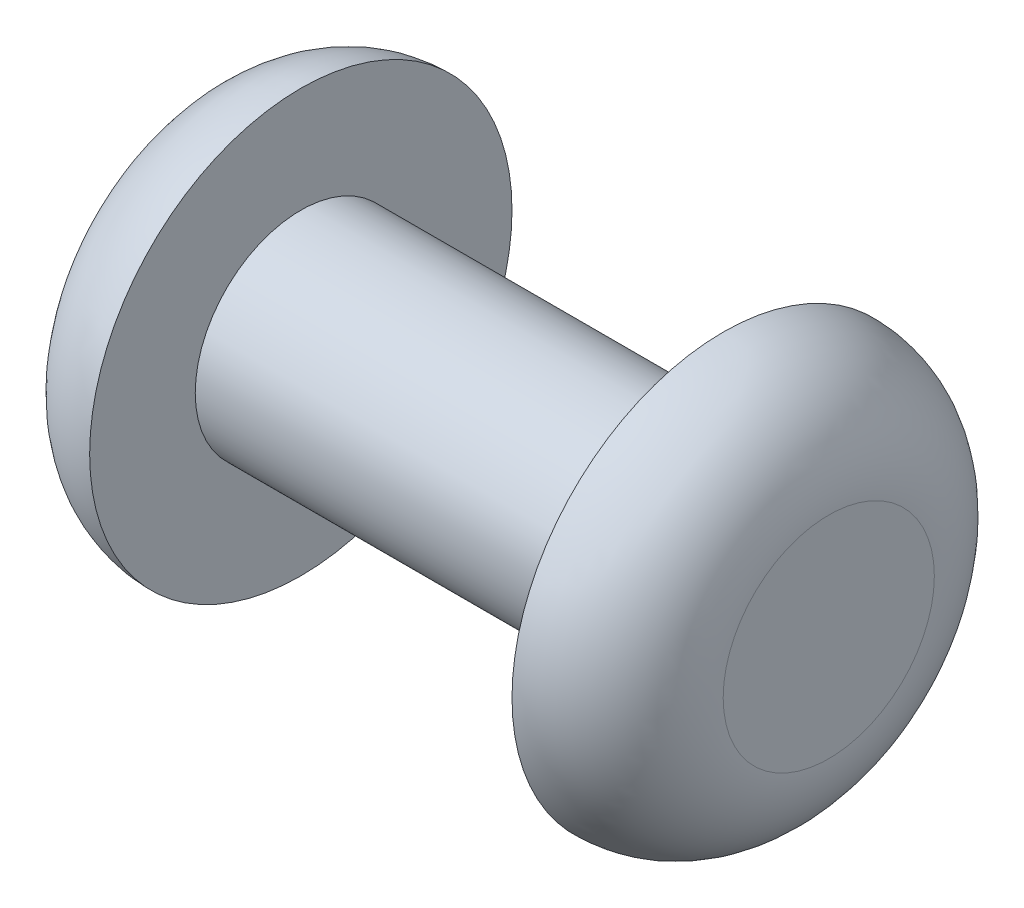
ISO-10303-21;
HEADER;
FILE_DESCRIPTION(('STEP AP214'),'2;1');
FILE_NAME('part.step','',(''),(''),'','','');
FILE_SCHEMA(('AUTOMOTIVE_DESIGN { 1 0 10303 214 1 1 1 1 }'));
ENDSEC;
DATA;
#1=APPLICATION_CONTEXT('core data for automotive mechanical design processes');
#2=APPLICATION_PROTOCOL_DEFINITION('international standard','automotive_design',2000,#1);
#3=PRODUCT_CONTEXT('',#1,'mechanical');
#4=PRODUCT('Part','Part','',(#3));
#5=PRODUCT_RELATED_PRODUCT_CATEGORY('part','',(#4));
#6=PRODUCT_DEFINITION_FORMATION('','',#4);
#7=PRODUCT_DEFINITION_CONTEXT('part definition',#1,'design');
#8=PRODUCT_DEFINITION('design','',#6,#7);
#9=PRODUCT_DEFINITION_SHAPE('','',#8);
#10=(LENGTH_UNIT() NAMED_UNIT(*) SI_UNIT(.MILLI.,.METRE.));
#11=(NAMED_UNIT(*) PLANE_ANGLE_UNIT() SI_UNIT($,.RADIAN.));
#12=(NAMED_UNIT(*) SI_UNIT($,.STERADIAN.) SOLID_ANGLE_UNIT());
#13=UNCERTAINTY_MEASURE_WITH_UNIT(LENGTH_MEASURE(1.E-05),#10,'distance_accuracy_value','');
#14=(GEOMETRIC_REPRESENTATION_CONTEXT(3) GLOBAL_UNCERTAINTY_ASSIGNED_CONTEXT((#13)) GLOBAL_UNIT_ASSIGNED_CONTEXT((#10,
#11,#12)) REPRESENTATION_CONTEXT('',''));
#15=CARTESIAN_POINT('',(0.,0.,0.));
#16=DIRECTION('',(0.,0.,1.));
#17=DIRECTION('',(1.,0.,0.));
#18=AXIS2_PLACEMENT_3D('',#15,#16,#17);
#19=CARTESIAN_POINT('',(40.,0.,0.));
#20=DIRECTION('',(-1.,0.,0.));
#21=DIRECTION('',(0.,0.,1.));
#22=AXIS2_PLACEMENT_3D('',#19,#20,#21);
#23=CYLINDRICAL_SURFACE('',#22,10.);
#24=CARTESIAN_POINT('',(40.,0.,0.));
#25=DIRECTION('',(1.,0.,0.));
#26=DIRECTION('',(0.,0.,-1.));
#27=AXIS2_PLACEMENT_3D('',#24,#25,#26);
#28=CIRCLE('',#27,10.);
#29=CARTESIAN_POINT('',(40.,0.,-10.));
#30=VERTEX_POINT('',#29);
#31=EDGE_CURVE('E41',#30,#30,#28,.T.);
#32=ORIENTED_EDGE('',*,*,#31,.F.);
#33=EDGE_LOOP('',(#32));
#34=FACE_BOUND('',#33,.T.);
#35=CARTESIAN_POINT('',(0.,0.,0.));
#36=DIRECTION('',(1.,0.,0.));
#37=DIRECTION('',(0.,0.,-1.));
#38=AXIS2_PLACEMENT_3D('',#35,#36,#37);
#39=CIRCLE('',#38,10.);
#40=CARTESIAN_POINT('',(0.,0.,-10.));
#41=VERTEX_POINT('',#40);
#42=EDGE_CURVE('E48',#41,#41,#39,.T.);
#43=ORIENTED_EDGE('',*,*,#42,.T.);
#44=EDGE_LOOP('',(#43));
#45=FACE_BOUND('',#44,.T.);
#46=ADVANCED_FACE('F30',(#34,#45),#23,.T.);
#47=CARTESIAN_POINT('',(50.,0.,0.));
#48=DIRECTION('',(1.,0.,0.));
#49=DIRECTION('',(0.,0.,-1.));
#50=AXIS2_PLACEMENT_3D('',#47,#48,#49);
#51=PLANE('',#50);
#52=CARTESIAN_POINT('',(50.,0.,0.));
#53=DIRECTION('',(1.,0.,0.));
#54=DIRECTION('',(0.,0.,-1.));
#55=AXIS2_PLACEMENT_3D('',#52,#53,#54);
#56=CIRCLE('',#55,10.);
#57=CARTESIAN_POINT('',(50.,0.,-10.));
#58=VERTEX_POINT('',#57);
#59=EDGE_CURVE('E37',#58,#58,#56,.T.);
#60=ORIENTED_EDGE('',*,*,#59,.T.);
#61=EDGE_LOOP('',(#60));
#62=FACE_BOUND('',#61,.T.);
#63=ADVANCED_FACE('F68',(#62),#51,.T.);
#64=CARTESIAN_POINT('',(40.,0.,0.));
#65=DIRECTION('',(1.,0.,0.));
#66=DIRECTION('',(0.,0.,-1.));
#67=AXIS2_PLACEMENT_3D('',#64,#65,#66);
#68=PLANE('',#67);
#69=ORIENTED_EDGE('',*,*,#31,.T.);
#70=EDGE_LOOP('',(#69));
#71=FACE_BOUND('',#70,.T.);
#72=CARTESIAN_POINT('',(40.,0.,0.));
#73=DIRECTION('',(1.,0.,0.));
#74=DIRECTION('',(0.,0.,-1.));
#75=AXIS2_PLACEMENT_3D('',#72,#73,#74);
#76=CIRCLE('',#75,20.);
#77=CARTESIAN_POINT('',(40.,0.,-20.));
#78=VERTEX_POINT('',#77);
#79=EDGE_CURVE('E45',#78,#78,#76,.T.);
#80=ORIENTED_EDGE('',*,*,#79,.F.);
#81=EDGE_LOOP('',(#80));
#82=FACE_BOUND('',#81,.T.);
#83=ADVANCED_FACE('F74',(#71,#82),#68,.F.);
#84=CARTESIAN_POINT('',(40.,0.,0.));
#85=DIRECTION('',(1.,0.,0.));
#86=DIRECTION('',(0.,0.,-1.));
#87=AXIS2_PLACEMENT_3D('',#84,#85,#86);
#88=DEGENERATE_TOROIDAL_SURFACE('',#87,10.,10.,.T.);
#89=ORIENTED_EDGE('',*,*,#79,.T.);
#90=EDGE_LOOP('',(#89));
#91=FACE_BOUND('',#90,.T.);
#92=ORIENTED_EDGE('',*,*,#59,.F.);
#93=EDGE_LOOP('',(#92));
#94=FACE_BOUND('',#93,.T.);
#95=ADVANCED_FACE('F79',(#91,#94),#88,.T.);
#96=CARTESIAN_POINT('',(-10.,0.,0.));
#97=DIRECTION('',(-1.,0.,0.));
#98=DIRECTION('',(0.,0.,-1.));
#99=AXIS2_PLACEMENT_3D('',#96,#97,#98);
#100=PLANE('',#99);
#101=CARTESIAN_POINT('',(-10.,0.,0.));
#102=DIRECTION('',(-1.,0.,0.));
#103=DIRECTION('',(0.,0.,1.));
#104=AXIS2_PLACEMENT_3D('',#101,#102,#103);
#105=CIRCLE('',#104,10.);
#106=CARTESIAN_POINT('',(-10.,0.,10.));
#107=VERTEX_POINT('',#106);
#108=EDGE_CURVE('E10',#107,#107,#105,.T.);
#109=ORIENTED_EDGE('',*,*,#108,.T.);
#110=EDGE_LOOP('',(#109));
#111=FACE_BOUND('',#110,.T.);
#112=ADVANCED_FACE('F64',(#111),#100,.T.);
#113=CARTESIAN_POINT('',(0.,0.,0.));
#114=DIRECTION('',(-1.,0.,0.));
#115=DIRECTION('',(0.,0.,-1.));
#116=AXIS2_PLACEMENT_3D('',#113,#114,#115);
#117=PLANE('',#116);
#118=ORIENTED_EDGE('',*,*,#42,.F.);
#119=EDGE_LOOP('',(#118));
#120=FACE_BOUND('',#119,.T.);
#121=CARTESIAN_POINT('',(0.,0.,0.));
#122=DIRECTION('',(1.,0.,0.));
#123=DIRECTION('',(0.,0.,-1.));
#124=AXIS2_PLACEMENT_3D('',#121,#122,#123);
#125=CIRCLE('',#124,20.);
#126=CARTESIAN_POINT('',(0.,0.,-20.));
#127=VERTEX_POINT('',#126);
#128=EDGE_CURVE('E50',#127,#127,#125,.T.);
#129=ORIENTED_EDGE('',*,*,#128,.T.);
#130=EDGE_LOOP('',(#129));
#131=FACE_BOUND('',#130,.T.);
#132=ADVANCED_FACE('F57',(#120,#131),#117,.F.);
#133=CARTESIAN_POINT('',(0.,0.,0.));
#134=DIRECTION('',(-1.,0.,0.));
#135=DIRECTION('',(0.,0.,1.));
#136=AXIS2_PLACEMENT_3D('',#133,#134,#135);
#137=DEGENERATE_TOROIDAL_SURFACE('',#136,10.,10.,.T.);
#138=ORIENTED_EDGE('',*,*,#108,.F.);
#139=EDGE_LOOP('',(#138));
#140=FACE_BOUND('',#139,.T.);
#141=ORIENTED_EDGE('',*,*,#128,.F.);
#142=EDGE_LOOP('',(#141));
#143=FACE_BOUND('',#142,.T.);
#144=ADVANCED_FACE('F32',(#140,#143),#137,.T.);
#145=CLOSED_SHELL('',(#46,#63,#83,#95,#112,#132,#144));
#146=MANIFOLD_SOLID_BREP('B2',#145);
#147=ADVANCED_BREP_SHAPE_REPRESENTATION('',(#18,#146),#14);
#148=SHAPE_DEFINITION_REPRESENTATION(#9,#147);
ENDSEC;
END-ISO-10303-21;
